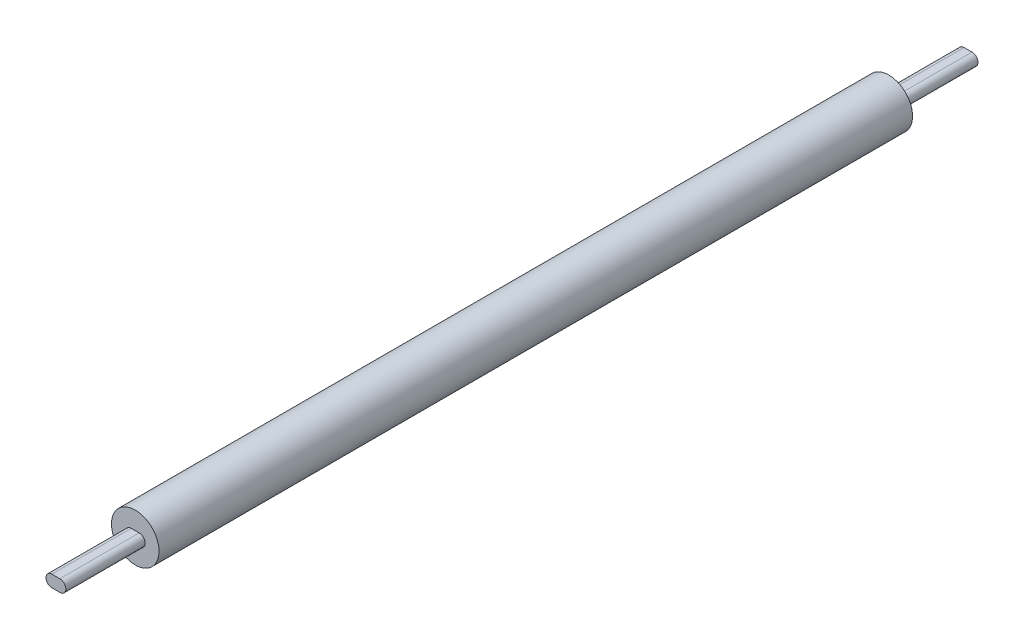
ISO-10303-21;
HEADER;
FILE_DESCRIPTION(('STEP AP214'),'2;1');
FILE_NAME('part.step','',(''),(''),'','','');
FILE_SCHEMA(('AUTOMOTIVE_DESIGN { 1 0 10303 214 1 1 1 1 }'));
ENDSEC;
DATA;
#1=APPLICATION_CONTEXT('core data for automotive mechanical design processes');
#2=APPLICATION_PROTOCOL_DEFINITION('international standard','automotive_design',2000,#1);
#3=PRODUCT_CONTEXT('',#1,'mechanical');
#4=PRODUCT('Part','Part','',(#3));
#5=PRODUCT_RELATED_PRODUCT_CATEGORY('part','',(#4));
#6=PRODUCT_DEFINITION_FORMATION('','',#4);
#7=PRODUCT_DEFINITION_CONTEXT('part definition',#1,'design');
#8=PRODUCT_DEFINITION('design','',#6,#7);
#9=PRODUCT_DEFINITION_SHAPE('','',#8);
#10=(LENGTH_UNIT() NAMED_UNIT(*) SI_UNIT(.MILLI.,.METRE.));
#11=(NAMED_UNIT(*) PLANE_ANGLE_UNIT() SI_UNIT($,.RADIAN.));
#12=(NAMED_UNIT(*) SI_UNIT($,.STERADIAN.) SOLID_ANGLE_UNIT());
#13=UNCERTAINTY_MEASURE_WITH_UNIT(LENGTH_MEASURE(1.E-05),#10,'distance_accuracy_value','');
#14=(GEOMETRIC_REPRESENTATION_CONTEXT(3) GLOBAL_UNCERTAINTY_ASSIGNED_CONTEXT((#13)) GLOBAL_UNIT_ASSIGNED_CONTEXT((#10,
#11,#12)) REPRESENTATION_CONTEXT('',''));
#15=CARTESIAN_POINT('',(0.,0.,0.));
#16=DIRECTION('',(0.,0.,1.));
#17=DIRECTION('',(1.,0.,0.));
#18=AXIS2_PLACEMENT_3D('',#15,#16,#17);
#19=CARTESIAN_POINT('',(0.,0.,0.));
#20=DIRECTION('',(0.,0.,1.));
#21=DIRECTION('',(1.,0.,0.));
#22=AXIS2_PLACEMENT_3D('',#19,#20,#21);
#23=PLANE('',#22);
#24=CARTESIAN_POINT('',(0.,0.,0.));
#25=DIRECTION('',(0.,0.,1.));
#26=DIRECTION('',(1.,0.,0.));
#27=AXIS2_PLACEMENT_3D('',#24,#25,#26);
#28=CIRCLE('',#27,6.);
#29=CARTESIAN_POINT('',(6.,0.,0.));
#30=VERTEX_POINT('',#29);
#31=EDGE_CURVE('E43',#30,#30,#28,.T.);
#32=ORIENTED_EDGE('',*,*,#31,.F.);
#33=EDGE_LOOP('',(#32));
#34=FACE_BOUND('',#33,.T.);
#35=CARTESIAN_POINT('',(1.,0.,0.));
#36=DIRECTION('',(0.,0.,-1.));
#37=DIRECTION('',(-1.,0.,0.));
#38=AXIS2_PLACEMENT_3D('',#35,#36,#37);
#39=CIRCLE('',#38,1.5);
#40=CARTESIAN_POINT('',(1.,1.5,0.));
#41=VERTEX_POINT('',#40);
#42=CARTESIAN_POINT('',(1.,-1.5,0.));
#43=VERTEX_POINT('',#42);
#44=EDGE_CURVE('E54',#41,#43,#39,.T.);
#45=ORIENTED_EDGE('',*,*,#44,.F.);
#46=DIRECTION('',(1.,0.,0.));
#47=VECTOR('',#46,1.);
#48=CARTESIAN_POINT('',(1.,1.5,0.));
#49=LINE('',#48,#47);
#50=CARTESIAN_POINT('',(-1.,1.5,0.));
#51=VERTEX_POINT('',#50);
#52=EDGE_CURVE('E58',#51,#41,#49,.T.);
#53=ORIENTED_EDGE('',*,*,#52,.F.);
#54=CARTESIAN_POINT('',(-1.,0.,0.));
#55=DIRECTION('',(0.,0.,-1.));
#56=DIRECTION('',(-1.,0.,0.));
#57=AXIS2_PLACEMENT_3D('',#54,#55,#56);
#58=CIRCLE('',#57,1.5);
#59=CARTESIAN_POINT('',(-1.,-1.5,0.));
#60=VERTEX_POINT('',#59);
#61=EDGE_CURVE('E288',#60,#51,#58,.T.);
#62=ORIENTED_EDGE('',*,*,#61,.F.);
#63=DIRECTION('',(-1.,0.,0.));
#64=VECTOR('',#63,1.);
#65=CARTESIAN_POINT('',(1.,-1.5,0.));
#66=LINE('',#65,#64);
#67=EDGE_CURVE('E294',#43,#60,#66,.T.);
#68=ORIENTED_EDGE('',*,*,#67,.F.);
#69=EDGE_LOOP('',(#45,#53,#62,#68));
#70=FACE_BOUND('',#69,.T.);
#71=ADVANCED_FACE('F39',(#34,#70),#23,.F.);
#72=CARTESIAN_POINT('',(0.,0.,190.));
#73=DIRECTION('',(0.,0.,-1.));
#74=DIRECTION('',(-1.,0.,0.));
#75=AXIS2_PLACEMENT_3D('',#72,#73,#74);
#76=CYLINDRICAL_SURFACE('',#75,6.);
#77=CARTESIAN_POINT('',(0.,0.,190.));
#78=DIRECTION('',(0.,0.,1.));
#79=DIRECTION('',(1.,0.,0.));
#80=AXIS2_PLACEMENT_3D('',#77,#78,#79);
#81=CIRCLE('',#80,6.);
#82=CARTESIAN_POINT('',(6.,0.,190.));
#83=VERTEX_POINT('',#82);
#84=EDGE_CURVE('E11',#83,#83,#81,.T.);
#85=ORIENTED_EDGE('',*,*,#84,.F.);
#86=EDGE_LOOP('',(#85));
#87=FACE_BOUND('',#86,.T.);
#88=ORIENTED_EDGE('',*,*,#31,.T.);
#89=EDGE_LOOP('',(#88));
#90=FACE_BOUND('',#89,.T.);
#91=ADVANCED_FACE('F41',(#87,#90),#76,.T.);
#92=CARTESIAN_POINT('',(0.,0.,190.));
#93=DIRECTION('',(0.,0.,1.));
#94=DIRECTION('',(1.,0.,0.));
#95=AXIS2_PLACEMENT_3D('',#92,#93,#94);
#96=PLANE('',#95);
#97=CARTESIAN_POINT('',(-1.,0.,190.));
#98=DIRECTION('',(0.,0.,1.));
#99=DIRECTION('',(1.,0.,0.));
#100=AXIS2_PLACEMENT_3D('',#97,#98,#99);
#101=CIRCLE('',#100,1.5);
#102=CARTESIAN_POINT('',(-1.,1.5,190.));
#103=VERTEX_POINT('',#102);
#104=CARTESIAN_POINT('',(-1.,-1.5,190.));
#105=VERTEX_POINT('',#104);
#106=EDGE_CURVE('E124',#103,#105,#101,.T.);
#107=ORIENTED_EDGE('',*,*,#106,.F.);
#108=DIRECTION('',(-1.,0.,0.));
#109=VECTOR('',#108,1.);
#110=CARTESIAN_POINT('',(-1.,1.5,190.));
#111=LINE('',#110,#109);
#112=CARTESIAN_POINT('',(1.,1.5,190.));
#113=VERTEX_POINT('',#112);
#114=EDGE_CURVE('E137',#113,#103,#111,.T.);
#115=ORIENTED_EDGE('',*,*,#114,.F.);
#116=CARTESIAN_POINT('',(1.,0.,190.));
#117=DIRECTION('',(0.,0.,1.));
#118=DIRECTION('',(1.,0.,0.));
#119=AXIS2_PLACEMENT_3D('',#116,#117,#118);
#120=CIRCLE('',#119,1.5);
#121=CARTESIAN_POINT('',(1.,-1.5,190.));
#122=VERTEX_POINT('',#121);
#123=EDGE_CURVE('E146',#122,#113,#120,.T.);
#124=ORIENTED_EDGE('',*,*,#123,.F.);
#125=DIRECTION('',(1.,0.,0.));
#126=VECTOR('',#125,1.);
#127=CARTESIAN_POINT('',(-1.,-1.5,190.));
#128=LINE('',#127,#126);
#129=EDGE_CURVE('E127',#105,#122,#128,.T.);
#130=ORIENTED_EDGE('',*,*,#129,.F.);
#131=EDGE_LOOP('',(#107,#115,#124,#130));
#132=FACE_BOUND('',#131,.T.);
#133=ORIENTED_EDGE('',*,*,#84,.T.);
#134=EDGE_LOOP('',(#133));
#135=FACE_BOUND('',#134,.T.);
#136=ADVANCED_FACE('F171',(#132,#135),#96,.T.);
#137=CARTESIAN_POINT('',(-1.,0.,210.));
#138=DIRECTION('',(0.,0.,-1.));
#139=DIRECTION('',(-1.,0.,0.));
#140=AXIS2_PLACEMENT_3D('',#137,#138,#139);
#141=CYLINDRICAL_SURFACE('',#140,1.5);
#142=ORIENTED_EDGE('',*,*,#106,.T.);
#143=DIRECTION('',(0.,0.,-1.));
#144=VECTOR('',#143,1.);
#145=CARTESIAN_POINT('',(-1.,-1.5,210.));
#146=LINE('',#145,#144);
#147=CARTESIAN_POINT('',(-1.,-1.5,210.));
#148=VERTEX_POINT('',#147);
#149=EDGE_CURVE('E159',#148,#105,#146,.T.);
#150=ORIENTED_EDGE('',*,*,#149,.F.);
#151=CARTESIAN_POINT('',(-1.,0.,210.));
#152=DIRECTION('',(0.,0.,1.));
#153=DIRECTION('',(1.,0.,0.));
#154=AXIS2_PLACEMENT_3D('',#151,#152,#153);
#155=CIRCLE('',#154,1.5);
#156=CARTESIAN_POINT('',(-1.,1.5,210.));
#157=VERTEX_POINT('',#156);
#158=EDGE_CURVE('E133',#157,#148,#155,.T.);
#159=ORIENTED_EDGE('',*,*,#158,.F.);
#160=DIRECTION('',(0.,0.,-1.));
#161=VECTOR('',#160,1.);
#162=CARTESIAN_POINT('',(-1.,1.5,210.));
#163=LINE('',#162,#161);
#164=EDGE_CURVE('E142',#157,#103,#163,.T.);
#165=ORIENTED_EDGE('',*,*,#164,.T.);
#166=EDGE_LOOP('',(#142,#150,#159,#165));
#167=FACE_BOUND('',#166,.T.);
#168=ADVANCED_FACE('F176',(#167),#141,.T.);
#169=CARTESIAN_POINT('',(-1.,-1.5,210.));
#170=DIRECTION('',(0.,1.,0.));
#171=DIRECTION('',(0.,0.,1.));
#172=AXIS2_PLACEMENT_3D('',#169,#170,#171);
#173=PLANE('',#172);
#174=ORIENTED_EDGE('',*,*,#129,.T.);
#175=DIRECTION('',(0.,0.,-1.));
#176=VECTOR('',#175,1.);
#177=CARTESIAN_POINT('',(1.,-1.5,210.));
#178=LINE('',#177,#176);
#179=CARTESIAN_POINT('',(1.,-1.5,210.));
#180=VERTEX_POINT('',#179);
#181=EDGE_CURVE('E156',#180,#122,#178,.T.);
#182=ORIENTED_EDGE('',*,*,#181,.F.);
#183=DIRECTION('',(1.,0.,0.));
#184=VECTOR('',#183,1.);
#185=CARTESIAN_POINT('',(-1.,-1.5,210.));
#186=LINE('',#185,#184);
#187=EDGE_CURVE('E136',#148,#180,#186,.T.);
#188=ORIENTED_EDGE('',*,*,#187,.F.);
#189=ORIENTED_EDGE('',*,*,#149,.T.);
#190=EDGE_LOOP('',(#174,#182,#188,#189));
#191=FACE_BOUND('',#190,.T.);
#192=ADVANCED_FACE('F180',(#191),#173,.F.);
#193=CARTESIAN_POINT('',(1.,0.,210.));
#194=DIRECTION('',(0.,0.,-1.));
#195=DIRECTION('',(-1.,0.,0.));
#196=AXIS2_PLACEMENT_3D('',#193,#194,#195);
#197=CYLINDRICAL_SURFACE('',#196,1.5);
#198=ORIENTED_EDGE('',*,*,#123,.T.);
#199=DIRECTION('',(0.,0.,-1.));
#200=VECTOR('',#199,1.);
#201=CARTESIAN_POINT('',(1.,1.5,210.));
#202=LINE('',#201,#200);
#203=CARTESIAN_POINT('',(1.,1.5,210.));
#204=VERTEX_POINT('',#203);
#205=EDGE_CURVE('E153',#204,#113,#202,.T.);
#206=ORIENTED_EDGE('',*,*,#205,.F.);
#207=CARTESIAN_POINT('',(1.,0.,210.));
#208=DIRECTION('',(0.,0.,1.));
#209=DIRECTION('',(1.,0.,0.));
#210=AXIS2_PLACEMENT_3D('',#207,#208,#209);
#211=CIRCLE('',#210,1.5);
#212=EDGE_CURVE('E139',#180,#204,#211,.T.);
#213=ORIENTED_EDGE('',*,*,#212,.F.);
#214=ORIENTED_EDGE('',*,*,#181,.T.);
#215=EDGE_LOOP('',(#198,#206,#213,#214));
#216=FACE_BOUND('',#215,.T.);
#217=ADVANCED_FACE('F184',(#216),#197,.T.);
#218=CARTESIAN_POINT('',(-1.,1.5,210.));
#219=DIRECTION('',(0.,-1.,0.));
#220=DIRECTION('',(0.,0.,-1.));
#221=AXIS2_PLACEMENT_3D('',#218,#219,#220);
#222=PLANE('',#221);
#223=ORIENTED_EDGE('',*,*,#114,.T.);
#224=ORIENTED_EDGE('',*,*,#164,.F.);
#225=DIRECTION('',(-1.,0.,0.));
#226=VECTOR('',#225,1.);
#227=CARTESIAN_POINT('',(-1.,1.5,210.));
#228=LINE('',#227,#226);
#229=EDGE_CURVE('E141',#204,#157,#228,.T.);
#230=ORIENTED_EDGE('',*,*,#229,.F.);
#231=ORIENTED_EDGE('',*,*,#205,.T.);
#232=EDGE_LOOP('',(#223,#224,#230,#231));
#233=FACE_BOUND('',#232,.T.);
#234=ADVANCED_FACE('F187',(#233),#222,.F.);
#235=CARTESIAN_POINT('',(-1.,0.,210.));
#236=DIRECTION('',(0.,0.,1.));
#237=DIRECTION('',(1.,0.,0.));
#238=AXIS2_PLACEMENT_3D('',#235,#236,#237);
#239=PLANE('',#238);
#240=ORIENTED_EDGE('',*,*,#158,.T.);
#241=ORIENTED_EDGE('',*,*,#187,.T.);
#242=ORIENTED_EDGE('',*,*,#212,.T.);
#243=ORIENTED_EDGE('',*,*,#229,.T.);
#244=EDGE_LOOP('',(#240,#241,#242,#243));
#245=FACE_BOUND('',#244,.T.);
#246=ADVANCED_FACE('F191',(#245),#239,.T.);
#247=CARTESIAN_POINT('',(1.,0.,-20.));
#248=DIRECTION('',(0.,0.,1.));
#249=DIRECTION('',(1.,0.,0.));
#250=AXIS2_PLACEMENT_3D('',#247,#248,#249);
#251=CYLINDRICAL_SURFACE('',#250,1.5);
#252=ORIENTED_EDGE('',*,*,#44,.T.);
#253=DIRECTION('',(0.,0.,1.));
#254=VECTOR('',#253,1.);
#255=CARTESIAN_POINT('',(1.,-1.5,-20.));
#256=LINE('',#255,#254);
#257=CARTESIAN_POINT('',(1.,-1.5,-20.));
#258=VERTEX_POINT('',#257);
#259=EDGE_CURVE('E107',#258,#43,#256,.T.);
#260=ORIENTED_EDGE('',*,*,#259,.F.);
#261=CARTESIAN_POINT('',(1.,0.,-20.));
#262=DIRECTION('',(0.,0.,-1.));
#263=DIRECTION('',(-1.,0.,0.));
#264=AXIS2_PLACEMENT_3D('',#261,#262,#263);
#265=CIRCLE('',#264,1.5);
#266=CARTESIAN_POINT('',(1.,1.5,-20.));
#267=VERTEX_POINT('',#266);
#268=EDGE_CURVE('E113',#267,#258,#265,.T.);
#269=ORIENTED_EDGE('',*,*,#268,.F.);
#270=DIRECTION('',(0.,0.,1.));
#271=VECTOR('',#270,1.);
#272=CARTESIAN_POINT('',(1.,1.5,-20.));
#273=LINE('',#272,#271);
#274=EDGE_CURVE('E286',#267,#41,#273,.T.);
#275=ORIENTED_EDGE('',*,*,#274,.T.);
#276=EDGE_LOOP('',(#252,#260,#269,#275));
#277=FACE_BOUND('',#276,.T.);
#278=ADVANCED_FACE('F123',(#277),#251,.T.);
#279=CARTESIAN_POINT('',(1.,-1.5,-20.));
#280=DIRECTION('',(0.,1.,0.));
#281=DIRECTION('',(0.,0.,1.));
#282=AXIS2_PLACEMENT_3D('',#279,#280,#281);
#283=PLANE('',#282);
#284=ORIENTED_EDGE('',*,*,#67,.T.);
#285=DIRECTION('',(0.,0.,1.));
#286=VECTOR('',#285,1.);
#287=CARTESIAN_POINT('',(-1.,-1.5,-20.));
#288=LINE('',#287,#286);
#289=CARTESIAN_POINT('',(-1.,-1.5,-20.));
#290=VERTEX_POINT('',#289);
#291=EDGE_CURVE('E109',#290,#60,#288,.T.);
#292=ORIENTED_EDGE('',*,*,#291,.F.);
#293=DIRECTION('',(-1.,0.,0.));
#294=VECTOR('',#293,1.);
#295=CARTESIAN_POINT('',(1.,-1.5,-20.));
#296=LINE('',#295,#294);
#297=EDGE_CURVE('E102',#258,#290,#296,.T.);
#298=ORIENTED_EDGE('',*,*,#297,.F.);
#299=ORIENTED_EDGE('',*,*,#259,.T.);
#300=EDGE_LOOP('',(#284,#292,#298,#299));
#301=FACE_BOUND('',#300,.T.);
#302=ADVANCED_FACE('F105',(#301),#283,.F.);
#303=CARTESIAN_POINT('',(-1.,0.,-20.));
#304=DIRECTION('',(0.,0.,1.));
#305=DIRECTION('',(1.,0.,0.));
#306=AXIS2_PLACEMENT_3D('',#303,#304,#305);
#307=CYLINDRICAL_SURFACE('',#306,1.5);
#308=ORIENTED_EDGE('',*,*,#61,.T.);
#309=DIRECTION('',(0.,0.,1.));
#310=VECTOR('',#309,1.);
#311=CARTESIAN_POINT('',(-1.,1.5,-20.));
#312=LINE('',#311,#310);
#313=CARTESIAN_POINT('',(-1.,1.5,-20.));
#314=VERTEX_POINT('',#313);
#315=EDGE_CURVE('E129',#314,#51,#312,.T.);
#316=ORIENTED_EDGE('',*,*,#315,.F.);
#317=CARTESIAN_POINT('',(-1.,0.,-20.));
#318=DIRECTION('',(0.,0.,-1.));
#319=DIRECTION('',(-1.,0.,0.));
#320=AXIS2_PLACEMENT_3D('',#317,#318,#319);
#321=CIRCLE('',#320,1.5);
#322=EDGE_CURVE('E112',#290,#314,#321,.T.);
#323=ORIENTED_EDGE('',*,*,#322,.F.);
#324=ORIENTED_EDGE('',*,*,#291,.T.);
#325=EDGE_LOOP('',(#308,#316,#323,#324));
#326=FACE_BOUND('',#325,.T.);
#327=ADVANCED_FACE('F200',(#326),#307,.T.);
#328=CARTESIAN_POINT('',(1.,1.5,-20.));
#329=DIRECTION('',(0.,-1.,0.));
#330=DIRECTION('',(0.,0.,-1.));
#331=AXIS2_PLACEMENT_3D('',#328,#329,#330);
#332=PLANE('',#331);
#333=ORIENTED_EDGE('',*,*,#52,.T.);
#334=ORIENTED_EDGE('',*,*,#274,.F.);
#335=DIRECTION('',(1.,0.,0.));
#336=VECTOR('',#335,1.);
#337=CARTESIAN_POINT('',(1.,1.5,-20.));
#338=LINE('',#337,#336);
#339=EDGE_CURVE('E118',#314,#267,#338,.T.);
#340=ORIENTED_EDGE('',*,*,#339,.F.);
#341=ORIENTED_EDGE('',*,*,#315,.T.);
#342=EDGE_LOOP('',(#333,#334,#340,#341));
#343=FACE_BOUND('',#342,.T.);
#344=ADVANCED_FACE('F203',(#343),#332,.F.);
#345=CARTESIAN_POINT('',(1.,0.,-20.));
#346=DIRECTION('',(0.,0.,-1.));
#347=DIRECTION('',(-1.,0.,0.));
#348=AXIS2_PLACEMENT_3D('',#345,#346,#347);
#349=PLANE('',#348);
#350=ORIENTED_EDGE('',*,*,#268,.T.);
#351=ORIENTED_EDGE('',*,*,#297,.T.);
#352=ORIENTED_EDGE('',*,*,#322,.T.);
#353=ORIENTED_EDGE('',*,*,#339,.T.);
#354=EDGE_LOOP('',(#350,#351,#352,#353));
#355=FACE_BOUND('',#354,.T.);
#356=ADVANCED_FACE('F116',(#355),#349,.T.);
#357=CLOSED_SHELL('',(#71,#91,#136,#168,#192,#217,#234,#246,#278,#302,#327,#344,#356));
#358=MANIFOLD_SOLID_BREP('B2',#357);
#359=ADVANCED_BREP_SHAPE_REPRESENTATION('',(#18,#358),#14);
#360=SHAPE_DEFINITION_REPRESENTATION(#9,#359);
ENDSEC;
END-ISO-10303-21;
